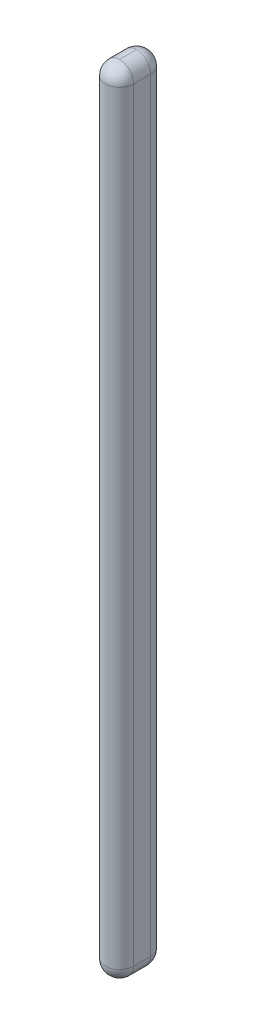
ISO-10303-21;
HEADER;
FILE_DESCRIPTION(('STEP AP214'),'2;1');
FILE_NAME('part.step','',(''),(''),'','','');
FILE_SCHEMA(('AUTOMOTIVE_DESIGN { 1 0 10303 214 1 1 1 1 }'));
ENDSEC;
DATA;
#1=APPLICATION_CONTEXT('core data for automotive mechanical design processes');
#2=APPLICATION_PROTOCOL_DEFINITION('international standard','automotive_design',2000,#1);
#3=PRODUCT_CONTEXT('',#1,'mechanical');
#4=PRODUCT('Part','Part','',(#3));
#5=PRODUCT_RELATED_PRODUCT_CATEGORY('part','',(#4));
#6=PRODUCT_DEFINITION_FORMATION('','',#4);
#7=PRODUCT_DEFINITION_CONTEXT('part definition',#1,'design');
#8=PRODUCT_DEFINITION('design','',#6,#7);
#9=PRODUCT_DEFINITION_SHAPE('','',#8);
#10=(LENGTH_UNIT() NAMED_UNIT(*) SI_UNIT(.MILLI.,.METRE.));
#11=(NAMED_UNIT(*) PLANE_ANGLE_UNIT() SI_UNIT($,.RADIAN.));
#12=(NAMED_UNIT(*) SI_UNIT($,.STERADIAN.) SOLID_ANGLE_UNIT());
#13=UNCERTAINTY_MEASURE_WITH_UNIT(LENGTH_MEASURE(1.E-05),#10,'distance_accuracy_value','');
#14=(GEOMETRIC_REPRESENTATION_CONTEXT(3) GLOBAL_UNCERTAINTY_ASSIGNED_CONTEXT((#13)) GLOBAL_UNIT_ASSIGNED_CONTEXT((#10,
#11,#12)) REPRESENTATION_CONTEXT('',''));
#15=CARTESIAN_POINT('',(0.,0.,0.));
#16=DIRECTION('',(0.,0.,1.));
#17=DIRECTION('',(1.,0.,0.));
#18=AXIS2_PLACEMENT_3D('',#15,#16,#17);
#19=CARTESIAN_POINT('',(0.,350.,7.50000000000001));
#20=DIRECTION('',(0.,-1.,0.));
#21=DIRECTION('',(0.,0.,-1.));
#22=AXIS2_PLACEMENT_3D('',#19,#20,#21);
#23=CYLINDRICAL_SURFACE('',#22,12.5);
#24=DIRECTION('',(0.,-1.,0.));
#25=VECTOR('',#24,1.);
#26=CARTESIAN_POINT('',(-12.5,350.,7.50000000000001));
#27=LINE('',#26,#25);
#28=CARTESIAN_POINT('',(-12.5,337.5,7.50000000000001));
#29=VERTEX_POINT('',#28);
#30=CARTESIAN_POINT('',(-12.5,-337.5,7.50000000000001));
#31=VERTEX_POINT('',#30);
#32=EDGE_CURVE('E111',#29,#31,#27,.T.);
#33=ORIENTED_EDGE('',*,*,#32,.T.);
#34=CARTESIAN_POINT('',(0.,-337.5,7.50000000000001));
#35=DIRECTION('',(0.,-1.,0.));
#36=DIRECTION('',(0.,0.,-1.));
#37=AXIS2_PLACEMENT_3D('',#34,#35,#36);
#38=CIRCLE('',#37,12.5);
#39=CARTESIAN_POINT('',(12.5,-337.5,7.5));
#40=VERTEX_POINT('',#39);
#41=EDGE_CURVE('E11',#31,#40,#38,.F.);
#42=ORIENTED_EDGE('',*,*,#41,.T.);
#43=DIRECTION('',(0.,-1.,0.));
#44=VECTOR('',#43,1.);
#45=CARTESIAN_POINT('',(12.5,350.,7.5));
#46=LINE('',#45,#44);
#47=CARTESIAN_POINT('',(12.5,337.5,7.5));
#48=VERTEX_POINT('',#47);
#49=EDGE_CURVE('E135',#48,#40,#46,.T.);
#50=ORIENTED_EDGE('',*,*,#49,.F.);
#51=CARTESIAN_POINT('',(0.,337.5,7.50000000000001));
#52=DIRECTION('',(0.,-1.,0.));
#53=DIRECTION('',(0.,0.,-1.));
#54=AXIS2_PLACEMENT_3D('',#51,#52,#53);
#55=CIRCLE('',#54,12.5);
#56=EDGE_CURVE('E51',#48,#29,#55,.T.);
#57=ORIENTED_EDGE('',*,*,#56,.T.);
#58=EDGE_LOOP('',(#33,#42,#50,#57));
#59=FACE_BOUND('',#58,.T.);
#60=ADVANCED_FACE('F41',(#59),#23,.T.);
#61=CARTESIAN_POINT('',(12.5,350.,7.5));
#62=DIRECTION('',(-1.,0.,0.));
#63=DIRECTION('',(0.,0.,1.));
#64=AXIS2_PLACEMENT_3D('',#61,#62,#63);
#65=PLANE('',#64);
#66=ORIENTED_EDGE('',*,*,#49,.T.);
#67=DIRECTION('',(0.,0.,-1.));
#68=VECTOR('',#67,1.);
#69=CARTESIAN_POINT('',(12.5,-337.5,7.5));
#70=LINE('',#69,#68);
#71=CARTESIAN_POINT('',(12.5,-337.5,-7.50000000000001));
#72=VERTEX_POINT('',#71);
#73=EDGE_CURVE('E131',#40,#72,#70,.T.);
#74=ORIENTED_EDGE('',*,*,#73,.T.);
#75=DIRECTION('',(0.,-1.,0.));
#76=VECTOR('',#75,1.);
#77=CARTESIAN_POINT('',(12.5,350.,-7.50000000000001));
#78=LINE('',#77,#76);
#79=CARTESIAN_POINT('',(12.5,337.5,-7.50000000000001));
#80=VERTEX_POINT('',#79);
#81=EDGE_CURVE('E138',#80,#72,#78,.T.);
#82=ORIENTED_EDGE('',*,*,#81,.F.);
#83=DIRECTION('',(0.,0.,-1.));
#84=VECTOR('',#83,1.);
#85=CARTESIAN_POINT('',(12.5,337.5,7.5));
#86=LINE('',#85,#84);
#87=EDGE_CURVE('E91',#80,#48,#86,.F.);
#88=ORIENTED_EDGE('',*,*,#87,.T.);
#89=EDGE_LOOP('',(#66,#74,#82,#88));
#90=FACE_BOUND('',#89,.T.);
#91=ADVANCED_FACE('F164',(#90),#65,.F.);
#92=CARTESIAN_POINT('',(0.,350.,-7.50000000000001));
#93=DIRECTION('',(0.,-1.,0.));
#94=DIRECTION('',(0.,0.,-1.));
#95=AXIS2_PLACEMENT_3D('',#92,#93,#94);
#96=CYLINDRICAL_SURFACE('',#95,12.5);
#97=ORIENTED_EDGE('',*,*,#81,.T.);
#98=CARTESIAN_POINT('',(0.,-337.5,-7.50000000000001));
#99=DIRECTION('',(0.,-1.,0.));
#100=DIRECTION('',(0.,0.,-1.));
#101=AXIS2_PLACEMENT_3D('',#98,#99,#100);
#102=CIRCLE('',#101,12.5);
#103=CARTESIAN_POINT('',(-12.5,-337.5,-7.50000000000001));
#104=VERTEX_POINT('',#103);
#105=EDGE_CURVE('E127',#72,#104,#102,.F.);
#106=ORIENTED_EDGE('',*,*,#105,.T.);
#107=DIRECTION('',(0.,-1.,0.));
#108=VECTOR('',#107,1.);
#109=CARTESIAN_POINT('',(-12.5,350.,-7.50000000000001));
#110=LINE('',#109,#108);
#111=CARTESIAN_POINT('',(-12.5,337.5,-7.50000000000001));
#112=VERTEX_POINT('',#111);
#113=EDGE_CURVE('E141',#112,#104,#110,.T.);
#114=ORIENTED_EDGE('',*,*,#113,.F.);
#115=CARTESIAN_POINT('',(0.,337.5,-7.50000000000001));
#116=DIRECTION('',(0.,-1.,0.));
#117=DIRECTION('',(0.,0.,-1.));
#118=AXIS2_PLACEMENT_3D('',#115,#116,#117);
#119=CIRCLE('',#118,12.5);
#120=EDGE_CURVE('E99',#112,#80,#119,.T.);
#121=ORIENTED_EDGE('',*,*,#120,.T.);
#122=EDGE_LOOP('',(#97,#106,#114,#121));
#123=FACE_BOUND('',#122,.T.);
#124=ADVANCED_FACE('F167',(#123),#96,.T.);
#125=CARTESIAN_POINT('',(-12.5,350.,7.50000000000001));
#126=DIRECTION('',(1.,0.,0.));
#127=DIRECTION('',(0.,0.,-1.));
#128=AXIS2_PLACEMENT_3D('',#125,#126,#127);
#129=PLANE('',#128);
#130=ORIENTED_EDGE('',*,*,#113,.T.);
#131=DIRECTION('',(0.,0.,1.));
#132=VECTOR('',#131,1.);
#133=CARTESIAN_POINT('',(-12.5,-337.5,7.50000000000001));
#134=LINE('',#133,#132);
#135=EDGE_CURVE('E60',#104,#31,#134,.T.);
#136=ORIENTED_EDGE('',*,*,#135,.T.);
#137=ORIENTED_EDGE('',*,*,#32,.F.);
#138=DIRECTION('',(0.,0.,1.));
#139=VECTOR('',#138,1.);
#140=CARTESIAN_POINT('',(-12.5,337.5,-7.5));
#141=LINE('',#140,#139);
#142=EDGE_CURVE('E125',#29,#112,#141,.F.);
#143=ORIENTED_EDGE('',*,*,#142,.T.);
#144=EDGE_LOOP('',(#130,#136,#137,#143));
#145=FACE_BOUND('',#144,.T.);
#146=ADVANCED_FACE('F197',(#145),#129,.F.);
#147=CARTESIAN_POINT('',(0.,-337.5,7.50000000000001));
#148=DIRECTION('',(0.,0.,1.));
#149=DIRECTION('',(1.,0.,0.));
#150=AXIS2_PLACEMENT_3D('',#147,#148,#149);
#151=CYLINDRICAL_SURFACE('',#150,12.5);
#152=CARTESIAN_POINT('',(0.,-337.5,7.50000000000001));
#153=DIRECTION('',(0.,0.,1.));
#154=DIRECTION('',(1.,0.,0.));
#155=AXIS2_PLACEMENT_3D('',#152,#153,#154);
#156=CIRCLE('',#155,12.5);
#157=CARTESIAN_POINT('',(0.,-350.,7.50000000000001));
#158=VERTEX_POINT('',#157);
#159=EDGE_CURVE('E109',#31,#158,#156,.T.);
#160=ORIENTED_EDGE('',*,*,#159,.F.);
#161=ORIENTED_EDGE('',*,*,#135,.F.);
#162=CARTESIAN_POINT('',(0.,-337.5,-7.50000000000001));
#163=DIRECTION('',(0.,0.,-1.));
#164=DIRECTION('',(-1.,0.,0.));
#165=AXIS2_PLACEMENT_3D('',#162,#163,#164);
#166=CIRCLE('',#165,12.5);
#167=CARTESIAN_POINT('',(0.,-350.,-7.5));
#168=VERTEX_POINT('',#167);
#169=EDGE_CURVE('E112',#168,#104,#166,.T.);
#170=ORIENTED_EDGE('',*,*,#169,.F.);
#171=DIRECTION('',(0.,0.,1.));
#172=VECTOR('',#171,1.);
#173=CARTESIAN_POINT('',(0.,-350.,7.50000000000001));
#174=LINE('',#173,#172);
#175=EDGE_CURVE('E115',#158,#168,#174,.F.);
#176=ORIENTED_EDGE('',*,*,#175,.F.);
#177=EDGE_LOOP('',(#160,#161,#170,#176));
#178=FACE_BOUND('',#177,.T.);
#179=ADVANCED_FACE('F150',(#178),#151,.T.);
#180=CARTESIAN_POINT('',(0.,-337.5,7.50000000000001));
#181=DIRECTION('',(0.,1.,0.));
#182=DIRECTION('',(0.,0.,1.));
#183=AXIS2_PLACEMENT_3D('',#180,#181,#182);
#184=SPHERICAL_SURFACE('',#183,12.5);
#185=ORIENTED_EDGE('',*,*,#41,.F.);
#186=ORIENTED_EDGE('',*,*,#159,.T.);
#187=CARTESIAN_POINT('',(0.,-337.5,7.50000000000001));
#188=DIRECTION('',(0.,0.,-1.));
#189=DIRECTION('',(-1.,0.,0.));
#190=AXIS2_PLACEMENT_3D('',#187,#188,#189);
#191=CIRCLE('',#190,12.5);
#192=EDGE_CURVE('E118',#40,#158,#191,.T.);
#193=ORIENTED_EDGE('',*,*,#192,.F.);
#194=EDGE_LOOP('',(#185,#186,#193));
#195=FACE_BOUND('',#194,.T.);
#196=ADVANCED_FACE('F153',(#195),#184,.T.);
#197=CARTESIAN_POINT('',(0.,-337.5,-7.50000000000001));
#198=DIRECTION('',(0.,1.,0.));
#199=DIRECTION('',(0.,0.,1.));
#200=AXIS2_PLACEMENT_3D('',#197,#198,#199);
#201=SPHERICAL_SURFACE('',#200,12.5);
#202=ORIENTED_EDGE('',*,*,#169,.T.);
#203=ORIENTED_EDGE('',*,*,#105,.F.);
#204=CARTESIAN_POINT('',(0.,-337.5,-7.50000000000001));
#205=DIRECTION('',(0.,0.,1.));
#206=DIRECTION('',(1.,0.,0.));
#207=AXIS2_PLACEMENT_3D('',#204,#205,#206);
#208=CIRCLE('',#207,12.5);
#209=EDGE_CURVE('E94',#168,#72,#208,.T.);
#210=ORIENTED_EDGE('',*,*,#209,.F.);
#211=EDGE_LOOP('',(#202,#203,#210));
#212=FACE_BOUND('',#211,.T.);
#213=ADVANCED_FACE('F190',(#212),#201,.T.);
#214=CARTESIAN_POINT('',(0.,-337.5,7.50000000000001));
#215=DIRECTION('',(0.,0.,-1.));
#216=DIRECTION('',(-1.,0.,0.));
#217=AXIS2_PLACEMENT_3D('',#214,#215,#216);
#218=CYLINDRICAL_SURFACE('',#217,12.5);
#219=ORIENTED_EDGE('',*,*,#192,.T.);
#220=ORIENTED_EDGE('',*,*,#175,.T.);
#221=ORIENTED_EDGE('',*,*,#209,.T.);
#222=ORIENTED_EDGE('',*,*,#73,.F.);
#223=EDGE_LOOP('',(#219,#220,#221,#222));
#224=FACE_BOUND('',#223,.T.);
#225=ADVANCED_FACE('F158',(#224),#218,.T.);
#226=CARTESIAN_POINT('',(0.,337.5,-7.50000000000001));
#227=DIRECTION('',(0.,1.,0.));
#228=DIRECTION('',(0.,0.,1.));
#229=AXIS2_PLACEMENT_3D('',#226,#227,#228);
#230=SPHERICAL_SURFACE('',#229,12.5);
#231=CARTESIAN_POINT('',(0.,337.5,-7.50000000000001));
#232=DIRECTION('',(0.,0.,1.));
#233=DIRECTION('',(1.,0.,0.));
#234=AXIS2_PLACEMENT_3D('',#231,#232,#233);
#235=CIRCLE('',#234,12.5);
#236=CARTESIAN_POINT('',(0.,350.,-7.50000000000001));
#237=VERTEX_POINT('',#236);
#238=EDGE_CURVE('E45',#80,#237,#235,.T.);
#239=ORIENTED_EDGE('',*,*,#238,.F.);
#240=ORIENTED_EDGE('',*,*,#120,.F.);
#241=CARTESIAN_POINT('',(0.,337.5,-7.50000000000001));
#242=DIRECTION('',(0.,0.,1.));
#243=DIRECTION('',(1.,0.,0.));
#244=AXIS2_PLACEMENT_3D('',#241,#242,#243);
#245=CIRCLE('',#244,12.5);
#246=EDGE_CURVE('E96',#237,#112,#245,.T.);
#247=ORIENTED_EDGE('',*,*,#246,.F.);
#248=EDGE_LOOP('',(#239,#240,#247));
#249=FACE_BOUND('',#248,.T.);
#250=ADVANCED_FACE('F43',(#249),#230,.T.);
#251=CARTESIAN_POINT('',(0.,337.5,7.50000000000001));
#252=DIRECTION('',(0.,0.,1.));
#253=DIRECTION('',(1.,0.,0.));
#254=AXIS2_PLACEMENT_3D('',#251,#252,#253);
#255=CYLINDRICAL_SURFACE('',#254,12.5);
#256=CARTESIAN_POINT('',(0.,337.5,7.50000000000001));
#257=DIRECTION('',(0.,0.,1.));
#258=DIRECTION('',(1.,0.,0.));
#259=AXIS2_PLACEMENT_3D('',#256,#257,#258);
#260=CIRCLE('',#259,12.5);
#261=CARTESIAN_POINT('',(0.,350.,7.50000000000001));
#262=VERTEX_POINT('',#261);
#263=EDGE_CURVE('E79',#48,#262,#260,.T.);
#264=ORIENTED_EDGE('',*,*,#263,.F.);
#265=ORIENTED_EDGE('',*,*,#87,.F.);
#266=ORIENTED_EDGE('',*,*,#238,.T.);
#267=DIRECTION('',(0.,0.,-1.));
#268=VECTOR('',#267,1.);
#269=CARTESIAN_POINT('',(0.,350.,-7.50000000000001));
#270=LINE('',#269,#268);
#271=EDGE_CURVE('E88',#262,#237,#270,.T.);
#272=ORIENTED_EDGE('',*,*,#271,.F.);
#273=EDGE_LOOP('',(#264,#265,#266,#272));
#274=FACE_BOUND('',#273,.T.);
#275=ADVANCED_FACE('F86',(#274),#255,.T.);
#276=CARTESIAN_POINT('',(0.,337.5,7.50000000000001));
#277=DIRECTION('',(0.,1.,0.));
#278=DIRECTION('',(0.,0.,1.));
#279=AXIS2_PLACEMENT_3D('',#276,#277,#278);
#280=SPHERICAL_SURFACE('',#279,12.5);
#281=ORIENTED_EDGE('',*,*,#56,.F.);
#282=ORIENTED_EDGE('',*,*,#263,.T.);
#283=CARTESIAN_POINT('',(0.,337.5,7.50000000000001));
#284=DIRECTION('',(0.,0.,-1.));
#285=DIRECTION('',(-1.,0.,0.));
#286=AXIS2_PLACEMENT_3D('',#283,#284,#285);
#287=CIRCLE('',#286,12.5);
#288=EDGE_CURVE('E105',#29,#262,#287,.T.);
#289=ORIENTED_EDGE('',*,*,#288,.F.);
#290=EDGE_LOOP('',(#281,#282,#289));
#291=FACE_BOUND('',#290,.T.);
#292=ADVANCED_FACE('F172',(#291),#280,.T.);
#293=CARTESIAN_POINT('',(0.,337.5,7.50000000000001));
#294=DIRECTION('',(0.,0.,-1.));
#295=DIRECTION('',(-1.,0.,0.));
#296=AXIS2_PLACEMENT_3D('',#293,#294,#295);
#297=CYLINDRICAL_SURFACE('',#296,12.5);
#298=ORIENTED_EDGE('',*,*,#246,.T.);
#299=ORIENTED_EDGE('',*,*,#142,.F.);
#300=ORIENTED_EDGE('',*,*,#288,.T.);
#301=ORIENTED_EDGE('',*,*,#271,.T.);
#302=EDGE_LOOP('',(#298,#299,#300,#301));
#303=FACE_BOUND('',#302,.T.);
#304=ADVANCED_FACE('F104',(#303),#297,.T.);
#305=CLOSED_SHELL('',(#60,#91,#124,#146,#179,#196,#213,#225,#250,#275,#292,#304));
#306=MANIFOLD_SOLID_BREP('B2',#305);
#307=ADVANCED_BREP_SHAPE_REPRESENTATION('',(#18,#306),#14);
#308=SHAPE_DEFINITION_REPRESENTATION(#9,#307);
ENDSEC;
END-ISO-10303-21;
